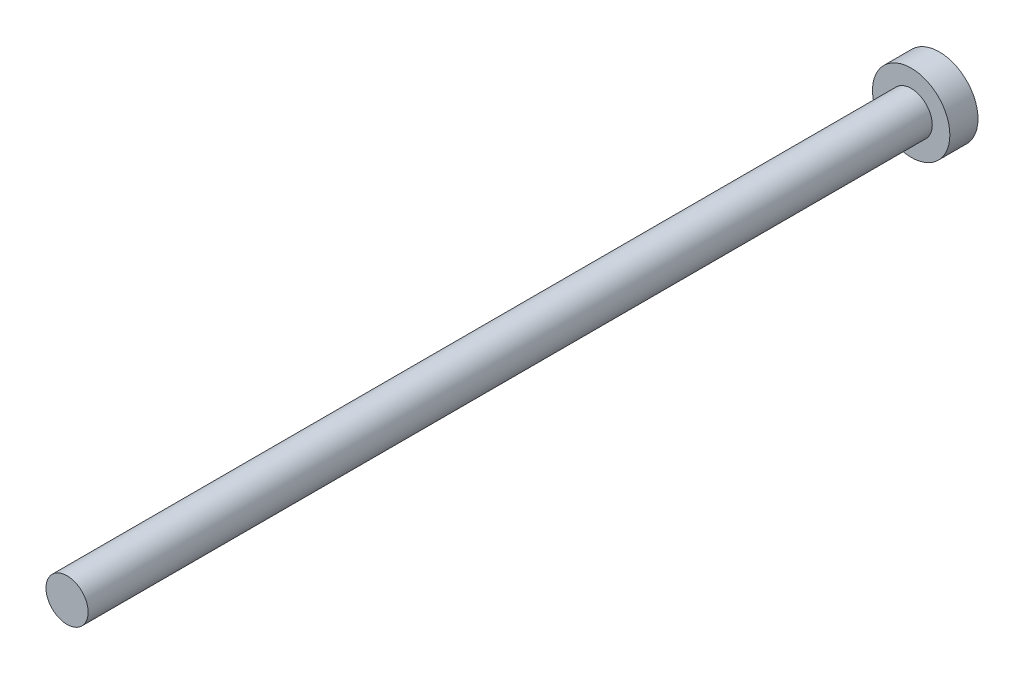
ISO-10303-21;
HEADER;
FILE_DESCRIPTION(('STEP AP214'),'2;1');
FILE_NAME('part.step','',(''),(''),'','','');
FILE_SCHEMA(('AUTOMOTIVE_DESIGN { 1 0 10303 214 1 1 1 1 }'));
ENDSEC;
DATA;
#1=APPLICATION_CONTEXT('core data for automotive mechanical design processes');
#2=APPLICATION_PROTOCOL_DEFINITION('international standard','automotive_design',2000,#1);
#3=PRODUCT_CONTEXT('',#1,'mechanical');
#4=PRODUCT('Part','Part','',(#3));
#5=PRODUCT_RELATED_PRODUCT_CATEGORY('part','',(#4));
#6=PRODUCT_DEFINITION_FORMATION('','',#4);
#7=PRODUCT_DEFINITION_CONTEXT('part definition',#1,'design');
#8=PRODUCT_DEFINITION('design','',#6,#7);
#9=PRODUCT_DEFINITION_SHAPE('','',#8);
#10=(LENGTH_UNIT() NAMED_UNIT(*) SI_UNIT(.MILLI.,.METRE.));
#11=(NAMED_UNIT(*) PLANE_ANGLE_UNIT() SI_UNIT($,.RADIAN.));
#12=(NAMED_UNIT(*) SI_UNIT($,.STERADIAN.) SOLID_ANGLE_UNIT());
#13=UNCERTAINTY_MEASURE_WITH_UNIT(LENGTH_MEASURE(1.E-05),#10,'distance_accuracy_value','');
#14=(GEOMETRIC_REPRESENTATION_CONTEXT(3) GLOBAL_UNCERTAINTY_ASSIGNED_CONTEXT((#13)) GLOBAL_UNIT_ASSIGNED_CONTEXT((#10,
#11,#12)) REPRESENTATION_CONTEXT('',''));
#15=CARTESIAN_POINT('',(0.,0.,0.));
#16=DIRECTION('',(0.,0.,1.));
#17=DIRECTION('',(1.,0.,0.));
#18=AXIS2_PLACEMENT_3D('',#15,#16,#17);
#19=CARTESIAN_POINT('',(0.,0.,34.));
#20=DIRECTION('',(0.,0.,-1.));
#21=DIRECTION('',(-1.,0.,0.));
#22=AXIS2_PLACEMENT_3D('',#19,#20,#21);
#23=CYLINDRICAL_SURFACE('',#22,1.5);
#24=CARTESIAN_POINT('',(0.,0.,34.));
#25=DIRECTION('',(0.,0.,1.));
#26=DIRECTION('',(1.,0.,0.));
#27=AXIS2_PLACEMENT_3D('',#24,#25,#26);
#28=CIRCLE('',#27,1.5);
#29=CARTESIAN_POINT('',(1.5,0.,34.));
#30=VERTEX_POINT('',#29);
#31=EDGE_CURVE('E10',#30,#30,#28,.T.);
#32=ORIENTED_EDGE('',*,*,#31,.F.);
#33=EDGE_LOOP('',(#32));
#34=FACE_BOUND('',#33,.T.);
#35=CARTESIAN_POINT('',(0.,0.,-26.));
#36=DIRECTION('',(0.,0.,1.));
#37=DIRECTION('',(1.,0.,0.));
#38=AXIS2_PLACEMENT_3D('',#35,#36,#37);
#39=CIRCLE('',#38,1.5);
#40=CARTESIAN_POINT('',(1.5,0.,-26.));
#41=VERTEX_POINT('',#40);
#42=EDGE_CURVE('E40',#41,#41,#39,.T.);
#43=ORIENTED_EDGE('',*,*,#42,.T.);
#44=EDGE_LOOP('',(#43));
#45=FACE_BOUND('',#44,.T.);
#46=ADVANCED_FACE('F37',(#34,#45),#23,.T.);
#47=CARTESIAN_POINT('',(0.,0.,34.));
#48=DIRECTION('',(0.,0.,1.));
#49=DIRECTION('',(1.,0.,0.));
#50=AXIS2_PLACEMENT_3D('',#47,#48,#49);
#51=PLANE('',#50);
#52=ORIENTED_EDGE('',*,*,#31,.T.);
#53=EDGE_LOOP('',(#52));
#54=FACE_BOUND('',#53,.T.);
#55=ADVANCED_FACE('F60',(#54),#51,.T.);
#56=CARTESIAN_POINT('',(0.,0.,-26.));
#57=DIRECTION('',(0.,0.,-1.));
#58=DIRECTION('',(-1.,0.,0.));
#59=AXIS2_PLACEMENT_3D('',#56,#57,#58);
#60=CYLINDRICAL_SURFACE('',#59,2.75);
#61=CARTESIAN_POINT('',(0.,0.,-26.));
#62=DIRECTION('',(0.,0.,1.));
#63=DIRECTION('',(1.,0.,0.));
#64=AXIS2_PLACEMENT_3D('',#61,#62,#63);
#65=CIRCLE('',#64,2.75);
#66=CARTESIAN_POINT('',(2.75,0.,-26.));
#67=VERTEX_POINT('',#66);
#68=EDGE_CURVE('E47',#67,#67,#65,.T.);
#69=ORIENTED_EDGE('',*,*,#68,.F.);
#70=EDGE_LOOP('',(#69));
#71=FACE_BOUND('',#70,.T.);
#72=CARTESIAN_POINT('',(0.,0.,-28.));
#73=DIRECTION('',(0.,0.,1.));
#74=DIRECTION('',(1.,0.,0.));
#75=AXIS2_PLACEMENT_3D('',#72,#73,#74);
#76=CIRCLE('',#75,2.75);
#77=CARTESIAN_POINT('',(2.75,0.,-28.));
#78=VERTEX_POINT('',#77);
#79=EDGE_CURVE('E49',#78,#78,#76,.T.);
#80=ORIENTED_EDGE('',*,*,#79,.T.);
#81=EDGE_LOOP('',(#80));
#82=FACE_BOUND('',#81,.T.);
#83=ADVANCED_FACE('F57',(#71,#82),#60,.T.);
#84=CARTESIAN_POINT('',(0.,0.,-26.));
#85=DIRECTION('',(0.,0.,1.));
#86=DIRECTION('',(1.,0.,0.));
#87=AXIS2_PLACEMENT_3D('',#84,#85,#86);
#88=PLANE('',#87);
#89=ORIENTED_EDGE('',*,*,#42,.F.);
#90=EDGE_LOOP('',(#89));
#91=FACE_BOUND('',#90,.T.);
#92=ORIENTED_EDGE('',*,*,#68,.T.);
#93=EDGE_LOOP('',(#92));
#94=FACE_BOUND('',#93,.T.);
#95=ADVANCED_FACE('F55',(#91,#94),#88,.T.);
#96=CARTESIAN_POINT('',(0.,0.,-28.));
#97=DIRECTION('',(0.,0.,1.));
#98=DIRECTION('',(1.,0.,0.));
#99=AXIS2_PLACEMENT_3D('',#96,#97,#98);
#100=PLANE('',#99);
#101=ORIENTED_EDGE('',*,*,#79,.F.);
#102=EDGE_LOOP('',(#101));
#103=FACE_BOUND('',#102,.T.);
#104=ADVANCED_FACE('F64',(#103),#100,.F.);
#105=CLOSED_SHELL('',(#46,#55,#83,#95,#104));
#106=MANIFOLD_SOLID_BREP('B2',#105);
#107=ADVANCED_BREP_SHAPE_REPRESENTATION('',(#18,#106),#14);
#108=SHAPE_DEFINITION_REPRESENTATION(#9,#107);
ENDSEC;
END-ISO-10303-21;
